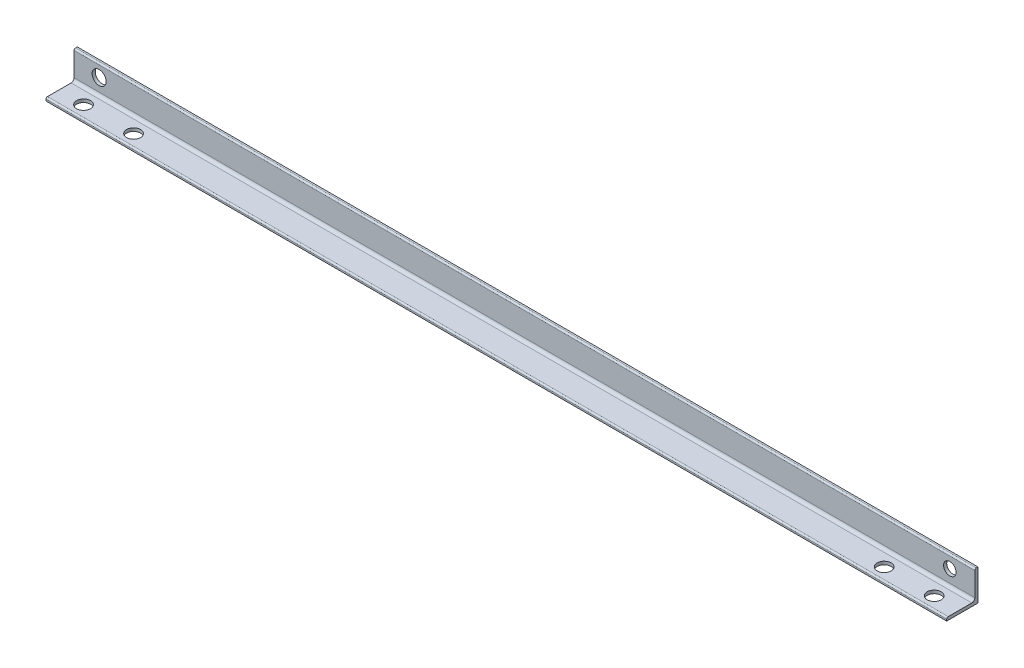
ISO-10303-21;
HEADER;
FILE_DESCRIPTION(('STEP AP214'),'2;1');
FILE_NAME('part.step','',(''),(''),'','','');
FILE_SCHEMA(('AUTOMOTIVE_DESIGN { 1 0 10303 214 1 1 1 1 }'));
ENDSEC;
DATA;
#1=APPLICATION_CONTEXT('core data for automotive mechanical design processes');
#2=APPLICATION_PROTOCOL_DEFINITION('international standard','automotive_design',2000,#1);
#3=PRODUCT_CONTEXT('',#1,'mechanical');
#4=PRODUCT('Part','Part','',(#3));
#5=PRODUCT_RELATED_PRODUCT_CATEGORY('part','',(#4));
#6=PRODUCT_DEFINITION_FORMATION('','',#4);
#7=PRODUCT_DEFINITION_CONTEXT('part definition',#1,'design');
#8=PRODUCT_DEFINITION('design','',#6,#7);
#9=PRODUCT_DEFINITION_SHAPE('','',#8);
#10=(LENGTH_UNIT() NAMED_UNIT(*) SI_UNIT(.MILLI.,.METRE.));
#11=(NAMED_UNIT(*) PLANE_ANGLE_UNIT() SI_UNIT($,.RADIAN.));
#12=(NAMED_UNIT(*) SI_UNIT($,.STERADIAN.) SOLID_ANGLE_UNIT());
#13=UNCERTAINTY_MEASURE_WITH_UNIT(LENGTH_MEASURE(1.E-05),#10,'distance_accuracy_value','');
#14=(GEOMETRIC_REPRESENTATION_CONTEXT(3) GLOBAL_UNCERTAINTY_ASSIGNED_CONTEXT((#13)) GLOBAL_UNIT_ASSIGNED_CONTEXT((#10,
#11,#12)) REPRESENTATION_CONTEXT('',''));
#15=CARTESIAN_POINT('',(0.,0.,0.));
#16=DIRECTION('',(0.,0.,1.));
#17=DIRECTION('',(1.,0.,0.));
#18=AXIS2_PLACEMENT_3D('',#15,#16,#17);
#19=CARTESIAN_POINT('',(457.2,3.14071867021258,50.9172526990474));
#20=DIRECTION('',(0.,-1.,0.));
#21=DIRECTION('',(0.,0.,-1.));
#22=AXIS2_PLACEMENT_3D('',#19,#20,#21);
#23=PLANE('',#22);
#24=DIRECTION('',(0.,0.,1.));
#25=VECTOR('',#24,1.);
#26=CARTESIAN_POINT('',(0.,3.14071867021258,50.9172526990474));
#27=LINE('',#26,#25);
#28=CARTESIAN_POINT('',(0.,3.14071867021258,50.9172526990474));
#29=VERTEX_POINT('',#28);
#30=CARTESIAN_POINT('',(0.,3.14071867021258,51.7554526990474));
#31=VERTEX_POINT('',#30);
#32=EDGE_CURVE('E134',#29,#31,#27,.T.);
#33=ORIENTED_EDGE('',*,*,#32,.T.);
#34=DIRECTION('',(-1.,0.,0.));
#35=VECTOR('',#34,1.);
#36=CARTESIAN_POINT('',(457.2,3.14071867021258,51.7554526990474));
#37=LINE('',#36,#35);
#38=CARTESIAN_POINT('',(457.2,3.14071867021258,51.7554526990474));
#39=VERTEX_POINT('',#38);
#40=EDGE_CURVE('E166',#31,#39,#37,.F.);
#41=ORIENTED_EDGE('',*,*,#40,.T.);
#42=DIRECTION('',(0.,0.,1.));
#43=VECTOR('',#42,1.);
#44=CARTESIAN_POINT('',(457.2,3.14071867021258,50.9172526990474));
#45=LINE('',#44,#43);
#46=CARTESIAN_POINT('',(457.2,3.14071867021258,50.9172526990474));
#47=VERTEX_POINT('',#46);
#48=EDGE_CURVE('E147',#47,#39,#45,.T.);
#49=ORIENTED_EDGE('',*,*,#48,.F.);
#50=DIRECTION('',(-1.,0.,0.));
#51=VECTOR('',#50,1.);
#52=CARTESIAN_POINT('',(457.2,3.14071867021258,50.9172526990474));
#53=LINE('',#52,#51);
#54=EDGE_CURVE('E130',#47,#29,#53,.T.);
#55=ORIENTED_EDGE('',*,*,#54,.T.);
#56=EDGE_LOOP('',(#33,#41,#49,#55));
#57=FACE_BOUND('',#56,.T.);
#58=ADVANCED_FACE('F32',(#57),#23,.F.);
#59=CARTESIAN_POINT('',(457.2,3.14071867021258,52.5174526990474));
#60=DIRECTION('',(0.,0.,-1.));
#61=DIRECTION('',(-1.,0.,0.));
#62=AXIS2_PLACEMENT_3D('',#59,#60,#61);
#63=PLANE('',#62);
#64=CARTESIAN_POINT('',(12.7,-3.20928132978742,52.5174526990474));
#65=DIRECTION('',(0.,0.,1.));
#66=DIRECTION('',(1.,0.,0.));
#67=AXIS2_PLACEMENT_3D('',#64,#65,#66);
#68=CIRCLE('',#67,3.556);
#69=CARTESIAN_POINT('',(16.256,-3.20928132978742,52.5174526990474));
#70=VERTEX_POINT('',#69);
#71=EDGE_CURVE('E246',#70,#70,#68,.T.);
#72=ORIENTED_EDGE('',*,*,#71,.F.);
#73=EDGE_LOOP('',(#72));
#74=FACE_BOUND('',#73,.T.);
#75=CARTESIAN_POINT('',(444.5,-3.20928132978742,52.5174526990474));
#76=DIRECTION('',(0.,0.,1.));
#77=DIRECTION('',(1.,0.,0.));
#78=AXIS2_PLACEMENT_3D('',#75,#76,#77);
#79=CIRCLE('',#78,3.17499999999997);
#80=CARTESIAN_POINT('',(447.675,-3.20928132978742,52.5174526990474));
#81=VERTEX_POINT('',#80);
#82=EDGE_CURVE('E252',#81,#81,#79,.T.);
#83=ORIENTED_EDGE('',*,*,#82,.F.);
#84=EDGE_LOOP('',(#83));
#85=FACE_BOUND('',#84,.T.);
#86=DIRECTION('',(0.,-1.,0.));
#87=VECTOR('',#86,1.);
#88=CARTESIAN_POINT('',(0.,3.14071867021258,52.5174526990474));
#89=LINE('',#88,#87);
#90=CARTESIAN_POINT('',(0.,2.37871867021258,52.5174526990474));
#91=VERTEX_POINT('',#90);
#92=CARTESIAN_POINT('',(0.,-9.61008132978742,52.5174526990474));
#93=VERTEX_POINT('',#92);
#94=EDGE_CURVE('E137',#91,#93,#89,.T.);
#95=ORIENTED_EDGE('',*,*,#94,.T.);
#96=DIRECTION('',(-1.,0.,0.));
#97=VECTOR('',#96,1.);
#98=CARTESIAN_POINT('',(457.2,-9.61008132978743,52.5174526990474));
#99=LINE('',#98,#97);
#100=CARTESIAN_POINT('',(457.2,-9.61008132978742,52.5174526990474));
#101=VERTEX_POINT('',#100);
#102=EDGE_CURVE('E53',#93,#101,#99,.F.);
#103=ORIENTED_EDGE('',*,*,#102,.T.);
#104=DIRECTION('',(0.,-1.,0.));
#105=VECTOR('',#104,1.);
#106=CARTESIAN_POINT('',(457.2,3.14071867021258,52.5174526990474));
#107=LINE('',#106,#105);
#108=CARTESIAN_POINT('',(457.2,2.37871867021258,52.5174526990474));
#109=VERTEX_POINT('',#108);
#110=EDGE_CURVE('E281',#109,#101,#107,.T.);
#111=ORIENTED_EDGE('',*,*,#110,.F.);
#112=DIRECTION('',(-1.,0.,0.));
#113=VECTOR('',#112,1.);
#114=CARTESIAN_POINT('',(457.2,2.37871867021258,52.5174526990474));
#115=LINE('',#114,#113);
#116=EDGE_CURVE('E163',#109,#91,#115,.T.);
#117=ORIENTED_EDGE('',*,*,#116,.T.);
#118=EDGE_LOOP('',(#95,#103,#111,#117));
#119=FACE_BOUND('',#118,.T.);
#120=ADVANCED_FACE('F192',(#74,#85,#119),#63,.F.);
#121=CARTESIAN_POINT('',(457.2,-11.1340813297874,52.5174526990474));
#122=DIRECTION('',(0.,-1.,0.));
#123=DIRECTION('',(0.,0.,-1.));
#124=AXIS2_PLACEMENT_3D('',#121,#122,#123);
#125=PLANE('',#124);
#126=CARTESIAN_POINT('',(444.5,-11.1340813297874,60.4422526990474));
#127=DIRECTION('',(0.,1.,0.));
#128=DIRECTION('',(0.,0.,1.));
#129=AXIS2_PLACEMENT_3D('',#126,#127,#128);
#130=CIRCLE('',#129,3.55600000000001);
#131=CARTESIAN_POINT('',(444.5,-11.1340813297874,63.9982526990474));
#132=VERTEX_POINT('',#131);
#133=EDGE_CURVE('E259',#132,#132,#130,.T.);
#134=ORIENTED_EDGE('',*,*,#133,.F.);
#135=EDGE_LOOP('',(#134));
#136=FACE_BOUND('',#135,.T.);
#137=CARTESIAN_POINT('',(38.1,-11.1340813297874,60.4422526990474));
#138=DIRECTION('',(0.,1.,0.));
#139=DIRECTION('',(0.,0.,1.));
#140=AXIS2_PLACEMENT_3D('',#137,#138,#139);
#141=CIRCLE('',#140,3.55600000000001);
#142=CARTESIAN_POINT('',(38.1,-11.1340813297874,63.9982526990474));
#143=VERTEX_POINT('',#142);
#144=EDGE_CURVE('E249',#143,#143,#141,.T.);
#145=ORIENTED_EDGE('',*,*,#144,.F.);
#146=EDGE_LOOP('',(#145));
#147=FACE_BOUND('',#146,.T.);
#148=CARTESIAN_POINT('',(12.7,-11.1340813297874,60.4422526990474));
#149=DIRECTION('',(0.,1.,0.));
#150=DIRECTION('',(0.,0.,1.));
#151=AXIS2_PLACEMENT_3D('',#148,#149,#150);
#152=CIRCLE('',#151,3.556);
#153=CARTESIAN_POINT('',(12.7,-11.1340813297874,63.9982526990474));
#154=VERTEX_POINT('',#153);
#155=EDGE_CURVE('E266',#154,#154,#152,.T.);
#156=ORIENTED_EDGE('',*,*,#155,.F.);
#157=EDGE_LOOP('',(#156));
#158=FACE_BOUND('',#157,.T.);
#159=CARTESIAN_POINT('',(419.1,-11.1340813297874,60.4422526990474));
#160=DIRECTION('',(0.,1.,0.));
#161=DIRECTION('',(0.,0.,1.));
#162=AXIS2_PLACEMENT_3D('',#159,#160,#161);
#163=CIRCLE('',#162,3.55600000000001);
#164=CARTESIAN_POINT('',(419.1,-11.1340813297874,63.9982526990474));
#165=VERTEX_POINT('',#164);
#166=EDGE_CURVE('E271',#165,#165,#163,.T.);
#167=ORIENTED_EDGE('',*,*,#166,.F.);
#168=EDGE_LOOP('',(#167));
#169=FACE_BOUND('',#168,.T.);
#170=DIRECTION('',(0.,0.,1.));
#171=VECTOR('',#170,1.);
#172=CARTESIAN_POINT('',(457.2,-11.1340813297874,52.5174526990474));
#173=LINE('',#172,#171);
#174=CARTESIAN_POINT('',(457.2,-11.1340813297874,54.0414526990474));
#175=VERTEX_POINT('',#174);
#176=CARTESIAN_POINT('',(457.2,-11.1340813297874,66.0302526990474));
#177=VERTEX_POINT('',#176);
#178=EDGE_CURVE('E113',#175,#177,#173,.T.);
#179=ORIENTED_EDGE('',*,*,#178,.F.);
#180=DIRECTION('',(-1.,0.,0.));
#181=VECTOR('',#180,1.);
#182=CARTESIAN_POINT('',(0.,-11.1340813297874,54.0414526990474));
#183=LINE('',#182,#181);
#184=CARTESIAN_POINT('',(0.,-11.1340813297874,54.0414526990474));
#185=VERTEX_POINT('',#184);
#186=EDGE_CURVE('E168',#175,#185,#183,.T.);
#187=ORIENTED_EDGE('',*,*,#186,.T.);
#188=DIRECTION('',(0.,0.,1.));
#189=VECTOR('',#188,1.);
#190=CARTESIAN_POINT('',(0.,-11.1340813297874,52.5174526990474));
#191=LINE('',#190,#189);
#192=CARTESIAN_POINT('',(0.,-11.1340813297874,66.0302526990474));
#193=VERTEX_POINT('',#192);
#194=EDGE_CURVE('E140',#185,#193,#191,.T.);
#195=ORIENTED_EDGE('',*,*,#194,.T.);
#196=DIRECTION('',(-1.,0.,0.));
#197=VECTOR('',#196,1.);
#198=CARTESIAN_POINT('',(457.2,-11.1340813297874,66.0302526990474));
#199=LINE('',#198,#197);
#200=EDGE_CURVE('E157',#193,#177,#199,.F.);
#201=ORIENTED_EDGE('',*,*,#200,.T.);
#202=EDGE_LOOP('',(#179,#187,#195,#201));
#203=FACE_BOUND('',#202,.T.);
#204=ADVANCED_FACE('F174',(#136,#147,#158,#169,#203),#125,.F.);
#205=CARTESIAN_POINT('',(457.2,-12.7342813297874,66.7922526990474));
#206=DIRECTION('',(0.,0.,-1.));
#207=DIRECTION('',(-1.,0.,0.));
#208=AXIS2_PLACEMENT_3D('',#205,#206,#207);
#209=PLANE('',#208);
#210=DIRECTION('',(0.,-1.,0.));
#211=VECTOR('',#210,1.);
#212=CARTESIAN_POINT('',(457.2,-12.7342813297874,66.7922526990474));
#213=LINE('',#212,#211);
#214=CARTESIAN_POINT('',(457.2,-11.8960813297874,66.7922526990474));
#215=VERTEX_POINT('',#214);
#216=CARTESIAN_POINT('',(457.2,-12.7342813297874,66.7922526990474));
#217=VERTEX_POINT('',#216);
#218=EDGE_CURVE('E102',#215,#217,#213,.T.);
#219=ORIENTED_EDGE('',*,*,#218,.F.);
#220=DIRECTION('',(-1.,0.,0.));
#221=VECTOR('',#220,1.);
#222=CARTESIAN_POINT('',(457.2,-11.8960813297874,66.7922526990474));
#223=LINE('',#222,#221);
#224=CARTESIAN_POINT('',(0.,-11.8960813297874,66.7922526990474));
#225=VERTEX_POINT('',#224);
#226=EDGE_CURVE('E122',#215,#225,#223,.T.);
#227=ORIENTED_EDGE('',*,*,#226,.T.);
#228=DIRECTION('',(0.,-1.,0.));
#229=VECTOR('',#228,1.);
#230=CARTESIAN_POINT('',(0.,-12.7342813297874,66.7922526990474));
#231=LINE('',#230,#229);
#232=CARTESIAN_POINT('',(0.,-12.7342813297874,66.7922526990474));
#233=VERTEX_POINT('',#232);
#234=EDGE_CURVE('E119',#225,#233,#231,.T.);
#235=ORIENTED_EDGE('',*,*,#234,.T.);
#236=DIRECTION('',(-1.,0.,0.));
#237=VECTOR('',#236,1.);
#238=CARTESIAN_POINT('',(457.2,-12.7342813297874,66.7922526990474));
#239=LINE('',#238,#237);
#240=EDGE_CURVE('E116',#217,#233,#239,.T.);
#241=ORIENTED_EDGE('',*,*,#240,.F.);
#242=EDGE_LOOP('',(#219,#227,#235,#241));
#243=FACE_BOUND('',#242,.T.);
#244=ADVANCED_FACE('F117',(#243),#209,.F.);
#245=CARTESIAN_POINT('',(457.2,-12.7342813297874,50.9172526990474));
#246=DIRECTION('',(0.,1.,0.));
#247=DIRECTION('',(0.,0.,1.));
#248=AXIS2_PLACEMENT_3D('',#245,#246,#247);
#249=PLANE('',#248);
#250=CARTESIAN_POINT('',(444.5,-12.7342813297874,60.4422526990474));
#251=DIRECTION('',(0.,1.,0.));
#252=DIRECTION('',(0.,0.,1.));
#253=AXIS2_PLACEMENT_3D('',#250,#251,#252);
#254=CIRCLE('',#253,3.55600000000001);
#255=CARTESIAN_POINT('',(444.5,-12.7342813297874,63.9982526990474));
#256=VERTEX_POINT('',#255);
#257=EDGE_CURVE('E138',#256,#256,#254,.T.);
#258=ORIENTED_EDGE('',*,*,#257,.T.);
#259=EDGE_LOOP('',(#258));
#260=FACE_BOUND('',#259,.T.);
#261=CARTESIAN_POINT('',(38.1,-12.7342813297874,60.4422526990474));
#262=DIRECTION('',(0.,1.,0.));
#263=DIRECTION('',(0.,0.,1.));
#264=AXIS2_PLACEMENT_3D('',#261,#262,#263);
#265=CIRCLE('',#264,3.55600000000001);
#266=CARTESIAN_POINT('',(38.1,-12.7342813297874,63.9982526990474));
#267=VERTEX_POINT('',#266);
#268=EDGE_CURVE('E263',#267,#267,#265,.T.);
#269=ORIENTED_EDGE('',*,*,#268,.T.);
#270=EDGE_LOOP('',(#269));
#271=FACE_BOUND('',#270,.T.);
#272=CARTESIAN_POINT('',(12.7,-12.7342813297874,60.4422526990474));
#273=DIRECTION('',(0.,1.,0.));
#274=DIRECTION('',(0.,0.,1.));
#275=AXIS2_PLACEMENT_3D('',#272,#273,#274);
#276=CIRCLE('',#275,3.556);
#277=CARTESIAN_POINT('',(12.7,-12.7342813297874,63.9982526990474));
#278=VERTEX_POINT('',#277);
#279=EDGE_CURVE('E274',#278,#278,#276,.T.);
#280=ORIENTED_EDGE('',*,*,#279,.T.);
#281=EDGE_LOOP('',(#280));
#282=FACE_BOUND('',#281,.T.);
#283=CARTESIAN_POINT('',(419.1,-12.7342813297874,60.4422526990474));
#284=DIRECTION('',(0.,1.,0.));
#285=DIRECTION('',(0.,0.,1.));
#286=AXIS2_PLACEMENT_3D('',#283,#284,#285);
#287=CIRCLE('',#286,3.55600000000001);
#288=CARTESIAN_POINT('',(419.1,-12.7342813297874,63.9982526990474));
#289=VERTEX_POINT('',#288);
#290=EDGE_CURVE('E262',#289,#289,#287,.T.);
#291=ORIENTED_EDGE('',*,*,#290,.T.);
#292=EDGE_LOOP('',(#291));
#293=FACE_BOUND('',#292,.T.);
#294=DIRECTION('',(0.,0.,-1.));
#295=VECTOR('',#294,1.);
#296=CARTESIAN_POINT('',(0.,-12.7342813297874,50.9172526990474));
#297=LINE('',#296,#295);
#298=CARTESIAN_POINT('',(0.,-12.7342813297874,50.9172526990474));
#299=VERTEX_POINT('',#298);
#300=EDGE_CURVE('E143',#233,#299,#297,.T.);
#301=ORIENTED_EDGE('',*,*,#300,.T.);
#302=DIRECTION('',(-1.,0.,0.));
#303=VECTOR('',#302,1.);
#304=CARTESIAN_POINT('',(457.2,-12.7342813297874,50.9172526990474));
#305=LINE('',#304,#303);
#306=CARTESIAN_POINT('',(457.2,-12.7342813297874,50.9172526990474));
#307=VERTEX_POINT('',#306);
#308=EDGE_CURVE('E123',#307,#299,#305,.T.);
#309=ORIENTED_EDGE('',*,*,#308,.F.);
#310=DIRECTION('',(0.,0.,-1.));
#311=VECTOR('',#310,1.);
#312=CARTESIAN_POINT('',(457.2,-12.7342813297874,50.9172526990474));
#313=LINE('',#312,#311);
#314=EDGE_CURVE('E106',#217,#307,#313,.T.);
#315=ORIENTED_EDGE('',*,*,#314,.F.);
#316=ORIENTED_EDGE('',*,*,#240,.T.);
#317=EDGE_LOOP('',(#301,#309,#315,#316));
#318=FACE_BOUND('',#317,.T.);
#319=ADVANCED_FACE('F125',(#260,#271,#282,#293,#318),#249,.F.);
#320=CARTESIAN_POINT('',(457.2,3.14071867021258,50.9172526990474));
#321=DIRECTION('',(0.,0.,1.));
#322=DIRECTION('',(1.,0.,0.));
#323=AXIS2_PLACEMENT_3D('',#320,#321,#322);
#324=PLANE('',#323);
#325=CARTESIAN_POINT('',(12.7,-3.20928132978742,50.9172526990474));
#326=DIRECTION('',(0.,0.,1.));
#327=DIRECTION('',(1.,0.,0.));
#328=AXIS2_PLACEMENT_3D('',#325,#326,#327);
#329=CIRCLE('',#328,3.556);
#330=CARTESIAN_POINT('',(16.256,-3.20928132978742,50.9172526990474));
#331=VERTEX_POINT('',#330);
#332=EDGE_CURVE('E243',#331,#331,#329,.T.);
#333=ORIENTED_EDGE('',*,*,#332,.T.);
#334=EDGE_LOOP('',(#333));
#335=FACE_BOUND('',#334,.T.);
#336=CARTESIAN_POINT('',(444.5,-3.20928132978742,50.9172526990474));
#337=DIRECTION('',(0.,0.,1.));
#338=DIRECTION('',(1.,0.,0.));
#339=AXIS2_PLACEMENT_3D('',#336,#337,#338);
#340=CIRCLE('',#339,3.17499999999997);
#341=CARTESIAN_POINT('',(447.675,-3.20928132978742,50.9172526990474));
#342=VERTEX_POINT('',#341);
#343=EDGE_CURVE('E247',#342,#342,#340,.T.);
#344=ORIENTED_EDGE('',*,*,#343,.T.);
#345=EDGE_LOOP('',(#344));
#346=FACE_BOUND('',#345,.T.);
#347=DIRECTION('',(0.,1.,0.));
#348=VECTOR('',#347,1.);
#349=CARTESIAN_POINT('',(0.,3.14071867021258,50.9172526990474));
#350=LINE('',#349,#348);
#351=EDGE_CURVE('E145',#299,#29,#350,.T.);
#352=ORIENTED_EDGE('',*,*,#351,.T.);
#353=ORIENTED_EDGE('',*,*,#54,.F.);
#354=DIRECTION('',(0.,1.,0.));
#355=VECTOR('',#354,1.);
#356=CARTESIAN_POINT('',(457.2,3.14071867021258,50.9172526990474));
#357=LINE('',#356,#355);
#358=EDGE_CURVE('E128',#307,#47,#357,.T.);
#359=ORIENTED_EDGE('',*,*,#358,.F.);
#360=ORIENTED_EDGE('',*,*,#308,.T.);
#361=EDGE_LOOP('',(#352,#353,#359,#360));
#362=FACE_BOUND('',#361,.T.);
#363=ADVANCED_FACE('F208',(#335,#346,#362),#324,.F.);
#364=CARTESIAN_POINT('',(457.2,0.,0.));
#365=DIRECTION('',(1.,0.,0.));
#366=DIRECTION('',(0.,0.,-1.));
#367=AXIS2_PLACEMENT_3D('',#364,#365,#366);
#368=PLANE('',#367);
#369=ORIENTED_EDGE('',*,*,#110,.T.);
#370=CARTESIAN_POINT('',(457.2,-9.61008132978743,54.0414526990474));
#371=DIRECTION('',(1.,0.,0.));
#372=DIRECTION('',(0.,0.,-1.));
#373=AXIS2_PLACEMENT_3D('',#370,#371,#372);
#374=CIRCLE('',#373,1.524);
#375=EDGE_CURVE('E11',#101,#175,#374,.F.);
#376=ORIENTED_EDGE('',*,*,#375,.T.);
#377=ORIENTED_EDGE('',*,*,#178,.T.);
#378=CARTESIAN_POINT('',(457.2,-11.8960813297874,66.0302526990474));
#379=DIRECTION('',(1.,0.,0.));
#380=DIRECTION('',(0.,0.,-1.));
#381=AXIS2_PLACEMENT_3D('',#378,#379,#380);
#382=CIRCLE('',#381,0.762);
#383=EDGE_CURVE('E109',#177,#215,#382,.T.);
#384=ORIENTED_EDGE('',*,*,#383,.T.);
#385=ORIENTED_EDGE('',*,*,#218,.T.);
#386=ORIENTED_EDGE('',*,*,#314,.T.);
#387=ORIENTED_EDGE('',*,*,#358,.T.);
#388=ORIENTED_EDGE('',*,*,#48,.T.);
#389=CARTESIAN_POINT('',(457.2,2.37871867021258,51.7554526990474));
#390=DIRECTION('',(1.,0.,0.));
#391=DIRECTION('',(0.,0.,-1.));
#392=AXIS2_PLACEMENT_3D('',#389,#390,#391);
#393=CIRCLE('',#392,0.762);
#394=EDGE_CURVE('E160',#39,#109,#393,.T.);
#395=ORIENTED_EDGE('',*,*,#394,.T.);
#396=EDGE_LOOP('',(#369,#376,#377,#384,#385,#386,#387,#388,#395));
#397=FACE_BOUND('',#396,.T.);
#398=ADVANCED_FACE('F104',(#397),#368,.T.);
#399=CARTESIAN_POINT('',(0.,0.,0.));
#400=DIRECTION('',(1.,0.,0.));
#401=DIRECTION('',(0.,0.,-1.));
#402=AXIS2_PLACEMENT_3D('',#399,#400,#401);
#403=PLANE('',#402);
#404=ORIENTED_EDGE('',*,*,#234,.F.);
#405=CARTESIAN_POINT('',(0.,-11.8960813297874,66.0302526990474));
#406=DIRECTION('',(1.,0.,0.));
#407=DIRECTION('',(0.,0.,-1.));
#408=AXIS2_PLACEMENT_3D('',#405,#406,#407);
#409=CIRCLE('',#408,0.762);
#410=EDGE_CURVE('E154',#225,#193,#409,.F.);
#411=ORIENTED_EDGE('',*,*,#410,.T.);
#412=ORIENTED_EDGE('',*,*,#194,.F.);
#413=CARTESIAN_POINT('',(0.,-9.61008132978743,54.0414526990474));
#414=DIRECTION('',(1.,0.,0.));
#415=DIRECTION('',(0.,0.,-1.));
#416=AXIS2_PLACEMENT_3D('',#413,#414,#415);
#417=CIRCLE('',#416,1.524);
#418=EDGE_CURVE('E40',#185,#93,#417,.T.);
#419=ORIENTED_EDGE('',*,*,#418,.T.);
#420=ORIENTED_EDGE('',*,*,#94,.F.);
#421=CARTESIAN_POINT('',(0.,2.37871867021258,51.7554526990474));
#422=DIRECTION('',(1.,0.,0.));
#423=DIRECTION('',(0.,0.,-1.));
#424=AXIS2_PLACEMENT_3D('',#421,#422,#423);
#425=CIRCLE('',#424,0.762);
#426=EDGE_CURVE('E152',#91,#31,#425,.F.);
#427=ORIENTED_EDGE('',*,*,#426,.T.);
#428=ORIENTED_EDGE('',*,*,#32,.F.);
#429=ORIENTED_EDGE('',*,*,#351,.F.);
#430=ORIENTED_EDGE('',*,*,#300,.F.);
#431=EDGE_LOOP('',(#404,#411,#412,#419,#420,#427,#428,#429,#430));
#432=FACE_BOUND('',#431,.T.);
#433=ADVANCED_FACE('F177',(#432),#403,.F.);
#434=CARTESIAN_POINT('',(457.2,-11.8960813297874,66.0302526990474));
#435=DIRECTION('',(-1.,0.,0.));
#436=DIRECTION('',(0.,0.,1.));
#437=AXIS2_PLACEMENT_3D('',#434,#435,#436);
#438=CYLINDRICAL_SURFACE('',#437,0.762);
#439=ORIENTED_EDGE('',*,*,#383,.F.);
#440=ORIENTED_EDGE('',*,*,#200,.F.);
#441=ORIENTED_EDGE('',*,*,#410,.F.);
#442=ORIENTED_EDGE('',*,*,#226,.F.);
#443=EDGE_LOOP('',(#439,#440,#441,#442));
#444=FACE_BOUND('',#443,.T.);
#445=ADVANCED_FACE('F180',(#444),#438,.T.);
#446=CARTESIAN_POINT('',(457.2,2.37871867021258,51.7554526990474));
#447=DIRECTION('',(-1.,0.,0.));
#448=DIRECTION('',(0.,0.,1.));
#449=AXIS2_PLACEMENT_3D('',#446,#447,#448);
#450=CYLINDRICAL_SURFACE('',#449,0.762);
#451=ORIENTED_EDGE('',*,*,#394,.F.);
#452=ORIENTED_EDGE('',*,*,#40,.F.);
#453=ORIENTED_EDGE('',*,*,#426,.F.);
#454=ORIENTED_EDGE('',*,*,#116,.F.);
#455=EDGE_LOOP('',(#451,#452,#453,#454));
#456=FACE_BOUND('',#455,.T.);
#457=ADVANCED_FACE('F182',(#456),#450,.T.);
#458=CARTESIAN_POINT('',(457.2,-9.61008132978743,54.0414526990474));
#459=DIRECTION('',(1.,0.,0.));
#460=DIRECTION('',(0.,0.,-1.));
#461=AXIS2_PLACEMENT_3D('',#458,#459,#460);
#462=CYLINDRICAL_SURFACE('',#461,1.524);
#463=ORIENTED_EDGE('',*,*,#375,.F.);
#464=ORIENTED_EDGE('',*,*,#102,.F.);
#465=ORIENTED_EDGE('',*,*,#418,.F.);
#466=ORIENTED_EDGE('',*,*,#186,.F.);
#467=EDGE_LOOP('',(#463,#464,#465,#466));
#468=FACE_BOUND('',#467,.T.);
#469=ADVANCED_FACE('F34',(#468),#462,.F.);
#470=CARTESIAN_POINT('',(419.1,-12.7342813297874,60.4422526990474));
#471=DIRECTION('',(0.,1.,0.));
#472=DIRECTION('',(0.,0.,1.));
#473=AXIS2_PLACEMENT_3D('',#470,#471,#472);
#474=CYLINDRICAL_SURFACE('',#473,3.55600000000001);
#475=ORIENTED_EDGE('',*,*,#290,.F.);
#476=EDGE_LOOP('',(#475));
#477=FACE_BOUND('',#476,.T.);
#478=ORIENTED_EDGE('',*,*,#166,.T.);
#479=EDGE_LOOP('',(#478));
#480=FACE_BOUND('',#479,.T.);
#481=ADVANCED_FACE('F219',(#477,#480),#474,.F.);
#482=CARTESIAN_POINT('',(12.7,-12.7342813297874,60.4422526990474));
#483=DIRECTION('',(0.,1.,0.));
#484=DIRECTION('',(0.,0.,1.));
#485=AXIS2_PLACEMENT_3D('',#482,#483,#484);
#486=CYLINDRICAL_SURFACE('',#485,3.556);
#487=ORIENTED_EDGE('',*,*,#279,.F.);
#488=EDGE_LOOP('',(#487));
#489=FACE_BOUND('',#488,.T.);
#490=ORIENTED_EDGE('',*,*,#155,.T.);
#491=EDGE_LOOP('',(#490));
#492=FACE_BOUND('',#491,.T.);
#493=ADVANCED_FACE('F215',(#489,#492),#486,.F.);
#494=CARTESIAN_POINT('',(38.1,-12.7342813297874,60.4422526990474));
#495=DIRECTION('',(0.,1.,0.));
#496=DIRECTION('',(0.,0.,1.));
#497=AXIS2_PLACEMENT_3D('',#494,#495,#496);
#498=CYLINDRICAL_SURFACE('',#497,3.55600000000001);
#499=ORIENTED_EDGE('',*,*,#268,.F.);
#500=EDGE_LOOP('',(#499));
#501=FACE_BOUND('',#500,.T.);
#502=ORIENTED_EDGE('',*,*,#144,.T.);
#503=EDGE_LOOP('',(#502));
#504=FACE_BOUND('',#503,.T.);
#505=ADVANCED_FACE('F218',(#501,#504),#498,.F.);
#506=CARTESIAN_POINT('',(444.5,-12.7342813297874,60.4422526990474));
#507=DIRECTION('',(0.,1.,0.));
#508=DIRECTION('',(0.,0.,1.));
#509=AXIS2_PLACEMENT_3D('',#506,#507,#508);
#510=CYLINDRICAL_SURFACE('',#509,3.55600000000001);
#511=ORIENTED_EDGE('',*,*,#257,.F.);
#512=EDGE_LOOP('',(#511));
#513=FACE_BOUND('',#512,.T.);
#514=ORIENTED_EDGE('',*,*,#133,.T.);
#515=EDGE_LOOP('',(#514));
#516=FACE_BOUND('',#515,.T.);
#517=ADVANCED_FACE('F226',(#513,#516),#510,.F.);
#518=CARTESIAN_POINT('',(444.5,-3.20928132978742,50.9172526990474));
#519=DIRECTION('',(0.,0.,1.));
#520=DIRECTION('',(1.,0.,0.));
#521=AXIS2_PLACEMENT_3D('',#518,#519,#520);
#522=CYLINDRICAL_SURFACE('',#521,3.17499999999997);
#523=ORIENTED_EDGE('',*,*,#343,.F.);
#524=EDGE_LOOP('',(#523));
#525=FACE_BOUND('',#524,.T.);
#526=ORIENTED_EDGE('',*,*,#82,.T.);
#527=EDGE_LOOP('',(#526));
#528=FACE_BOUND('',#527,.T.);
#529=ADVANCED_FACE('F230',(#525,#528),#522,.F.);
#530=CARTESIAN_POINT('',(12.7,-3.20928132978742,50.9172526990474));
#531=DIRECTION('',(0.,0.,1.));
#532=DIRECTION('',(1.,0.,0.));
#533=AXIS2_PLACEMENT_3D('',#530,#531,#532);
#534=CYLINDRICAL_SURFACE('',#533,3.556);
#535=ORIENTED_EDGE('',*,*,#332,.F.);
#536=EDGE_LOOP('',(#535));
#537=FACE_BOUND('',#536,.T.);
#538=ORIENTED_EDGE('',*,*,#71,.T.);
#539=EDGE_LOOP('',(#538));
#540=FACE_BOUND('',#539,.T.);
#541=ADVANCED_FACE('F234',(#537,#540),#534,.F.);
#542=CLOSED_SHELL('',(#58,#120,#204,#244,#319,#363,#398,#433,#445,#457,#469,#481,#493,#505,#517,
#529,#541));
#543=MANIFOLD_SOLID_BREP('B2',#542);
#544=ADVANCED_BREP_SHAPE_REPRESENTATION('',(#18,#543),#14);
#545=SHAPE_DEFINITION_REPRESENTATION(#9,#544);
ENDSEC;
END-ISO-10303-21;
